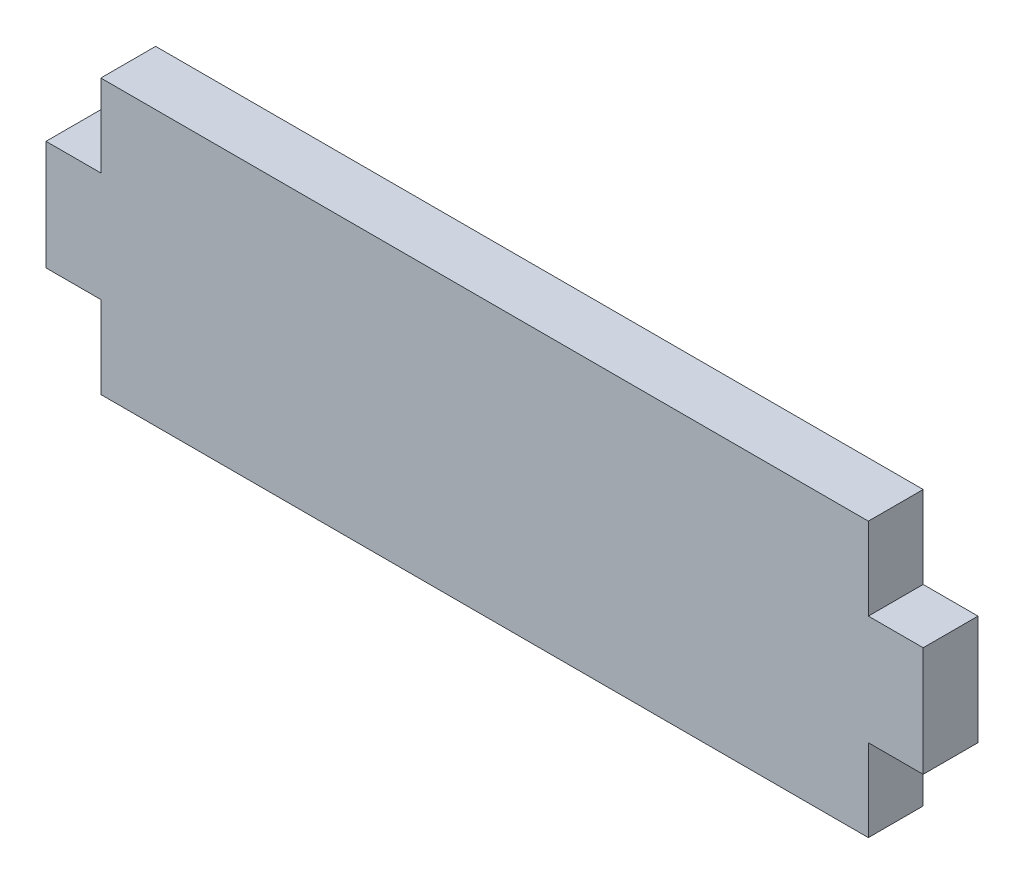
ISO-10303-21;
HEADER;
FILE_DESCRIPTION(('STEP AP214'),'2;1');
FILE_NAME('part.step','',(''),(''),'','','');
FILE_SCHEMA(('AUTOMOTIVE_DESIGN { 1 0 10303 214 1 1 1 1 }'));
ENDSEC;
DATA;
#1=APPLICATION_CONTEXT('core data for automotive mechanical design processes');
#2=APPLICATION_PROTOCOL_DEFINITION('international standard','automotive_design',2000,#1);
#3=PRODUCT_CONTEXT('',#1,'mechanical');
#4=PRODUCT('Part','Part','',(#3));
#5=PRODUCT_RELATED_PRODUCT_CATEGORY('part','',(#4));
#6=PRODUCT_DEFINITION_FORMATION('','',#4);
#7=PRODUCT_DEFINITION_CONTEXT('part definition',#1,'design');
#8=PRODUCT_DEFINITION('design','',#6,#7);
#9=PRODUCT_DEFINITION_SHAPE('','',#8);
#10=(LENGTH_UNIT() NAMED_UNIT(*) SI_UNIT(.MILLI.,.METRE.));
#11=(NAMED_UNIT(*) PLANE_ANGLE_UNIT() SI_UNIT($,.RADIAN.));
#12=(NAMED_UNIT(*) SI_UNIT($,.STERADIAN.) SOLID_ANGLE_UNIT());
#13=UNCERTAINTY_MEASURE_WITH_UNIT(LENGTH_MEASURE(1.E-05),#10,'distance_accuracy_value','');
#14=(GEOMETRIC_REPRESENTATION_CONTEXT(3) GLOBAL_UNCERTAINTY_ASSIGNED_CONTEXT((#13)) GLOBAL_UNIT_ASSIGNED_CONTEXT((#10,
#11,#12)) REPRESENTATION_CONTEXT('',''));
#15=CARTESIAN_POINT('',(0.,0.,0.));
#16=DIRECTION('',(0.,0.,1.));
#17=DIRECTION('',(1.,0.,0.));
#18=AXIS2_PLACEMENT_3D('',#15,#16,#17);
#19=CARTESIAN_POINT('',(35.,-5.,5.));
#20=DIRECTION('',(-1.,0.,0.));
#21=DIRECTION('',(0.,-1.,0.));
#22=AXIS2_PLACEMENT_3D('',#19,#20,#21);
#23=PLANE('',#22);
#24=DIRECTION('',(0.,1.,0.));
#25=VECTOR('',#24,1.);
#26=CARTESIAN_POINT('',(35.,-5.,0.));
#27=LINE('',#26,#25);
#28=CARTESIAN_POINT('',(35.,-12.5,0.));
#29=VERTEX_POINT('',#28);
#30=CARTESIAN_POINT('',(35.,-5.,0.));
#31=VERTEX_POINT('',#30);
#32=EDGE_CURVE('E164',#29,#31,#27,.T.);
#33=ORIENTED_EDGE('',*,*,#32,.T.);
#34=DIRECTION('',(0.,0.,-1.));
#35=VECTOR('',#34,1.);
#36=CARTESIAN_POINT('',(35.,-5.,5.));
#37=LINE('',#36,#35);
#38=CARTESIAN_POINT('',(35.,-5.,5.));
#39=VERTEX_POINT('',#38);
#40=EDGE_CURVE('E11',#39,#31,#37,.T.);
#41=ORIENTED_EDGE('',*,*,#40,.F.);
#42=DIRECTION('',(0.,1.,0.));
#43=VECTOR('',#42,1.);
#44=CARTESIAN_POINT('',(35.,-5.,5.));
#45=LINE('',#44,#43);
#46=CARTESIAN_POINT('',(35.,-12.5,5.));
#47=VERTEX_POINT('',#46);
#48=EDGE_CURVE('E198',#47,#39,#45,.T.);
#49=ORIENTED_EDGE('',*,*,#48,.F.);
#50=DIRECTION('',(0.,0.,-1.));
#51=VECTOR('',#50,1.);
#52=CARTESIAN_POINT('',(35.,-12.5,5.));
#53=LINE('',#52,#51);
#54=EDGE_CURVE('E160',#47,#29,#53,.T.);
#55=ORIENTED_EDGE('',*,*,#54,.T.);
#56=EDGE_LOOP('',(#33,#41,#49,#55));
#57=FACE_BOUND('',#56,.T.);
#58=ADVANCED_FACE('F39',(#57),#23,.F.);
#59=CARTESIAN_POINT('',(40.,-5.,5.));
#60=DIRECTION('',(0.,1.,0.));
#61=DIRECTION('',(0.,0.,1.));
#62=AXIS2_PLACEMENT_3D('',#59,#60,#61);
#63=PLANE('',#62);
#64=DIRECTION('',(1.,0.,0.));
#65=VECTOR('',#64,1.);
#66=CARTESIAN_POINT('',(40.,-5.,0.));
#67=LINE('',#66,#65);
#68=CARTESIAN_POINT('',(40.,-5.,0.));
#69=VERTEX_POINT('',#68);
#70=EDGE_CURVE('E168',#31,#69,#67,.T.);
#71=ORIENTED_EDGE('',*,*,#70,.T.);
#72=DIRECTION('',(0.,0.,-1.));
#73=VECTOR('',#72,1.);
#74=CARTESIAN_POINT('',(40.,-5.,5.));
#75=LINE('',#74,#73);
#76=CARTESIAN_POINT('',(40.,-5.,5.));
#77=VERTEX_POINT('',#76);
#78=EDGE_CURVE('E48',#77,#69,#75,.T.);
#79=ORIENTED_EDGE('',*,*,#78,.F.);
#80=DIRECTION('',(1.,0.,0.));
#81=VECTOR('',#80,1.);
#82=CARTESIAN_POINT('',(40.,-5.,5.));
#83=LINE('',#82,#81);
#84=EDGE_CURVE('E111',#39,#77,#83,.T.);
#85=ORIENTED_EDGE('',*,*,#84,.F.);
#86=ORIENTED_EDGE('',*,*,#40,.T.);
#87=EDGE_LOOP('',(#71,#79,#85,#86));
#88=FACE_BOUND('',#87,.T.);
#89=ADVANCED_FACE('F292',(#88),#63,.F.);
#90=CARTESIAN_POINT('',(40.,5.,5.));
#91=DIRECTION('',(-1.,0.,0.));
#92=DIRECTION('',(0.,0.,1.));
#93=AXIS2_PLACEMENT_3D('',#90,#91,#92);
#94=PLANE('',#93);
#95=DIRECTION('',(0.,1.,0.));
#96=VECTOR('',#95,1.);
#97=CARTESIAN_POINT('',(40.,5.,0.));
#98=LINE('',#97,#96);
#99=CARTESIAN_POINT('',(40.,5.,0.));
#100=VERTEX_POINT('',#99);
#101=EDGE_CURVE('E171',#69,#100,#98,.T.);
#102=ORIENTED_EDGE('',*,*,#101,.T.);
#103=DIRECTION('',(0.,0.,-1.));
#104=VECTOR('',#103,1.);
#105=CARTESIAN_POINT('',(40.,5.,5.));
#106=LINE('',#105,#104);
#107=CARTESIAN_POINT('',(40.,5.,5.));
#108=VERTEX_POINT('',#107);
#109=EDGE_CURVE('E225',#108,#100,#106,.T.);
#110=ORIENTED_EDGE('',*,*,#109,.F.);
#111=DIRECTION('',(0.,1.,0.));
#112=VECTOR('',#111,1.);
#113=CARTESIAN_POINT('',(40.,5.,5.));
#114=LINE('',#113,#112);
#115=EDGE_CURVE('E235',#77,#108,#114,.T.);
#116=ORIENTED_EDGE('',*,*,#115,.F.);
#117=ORIENTED_EDGE('',*,*,#78,.T.);
#118=EDGE_LOOP('',(#102,#110,#116,#117));
#119=FACE_BOUND('',#118,.T.);
#120=ADVANCED_FACE('F233',(#119),#94,.F.);
#121=CARTESIAN_POINT('',(40.,5.,5.));
#122=DIRECTION('',(0.,-1.,0.));
#123=DIRECTION('',(0.,0.,-1.));
#124=AXIS2_PLACEMENT_3D('',#121,#122,#123);
#125=PLANE('',#124);
#126=DIRECTION('',(-1.,0.,0.));
#127=VECTOR('',#126,1.);
#128=CARTESIAN_POINT('',(40.,5.,0.));
#129=LINE('',#128,#127);
#130=CARTESIAN_POINT('',(35.,5.,0.));
#131=VERTEX_POINT('',#130);
#132=EDGE_CURVE('E174',#100,#131,#129,.T.);
#133=ORIENTED_EDGE('',*,*,#132,.T.);
#134=DIRECTION('',(0.,0.,-1.));
#135=VECTOR('',#134,1.);
#136=CARTESIAN_POINT('',(35.,5.,5.));
#137=LINE('',#136,#135);
#138=CARTESIAN_POINT('',(35.,5.,5.));
#139=VERTEX_POINT('',#138);
#140=EDGE_CURVE('E221',#139,#131,#137,.T.);
#141=ORIENTED_EDGE('',*,*,#140,.F.);
#142=DIRECTION('',(-1.,0.,0.));
#143=VECTOR('',#142,1.);
#144=CARTESIAN_POINT('',(40.,5.,5.));
#145=LINE('',#144,#143);
#146=EDGE_CURVE('E254',#108,#139,#145,.T.);
#147=ORIENTED_EDGE('',*,*,#146,.F.);
#148=ORIENTED_EDGE('',*,*,#109,.T.);
#149=EDGE_LOOP('',(#133,#141,#147,#148));
#150=FACE_BOUND('',#149,.T.);
#151=ADVANCED_FACE('F244',(#150),#125,.F.);
#152=CARTESIAN_POINT('',(35.,12.5,5.));
#153=DIRECTION('',(-1.,0.,0.));
#154=DIRECTION('',(0.,-1.,0.));
#155=AXIS2_PLACEMENT_3D('',#152,#153,#154);
#156=PLANE('',#155);
#157=DIRECTION('',(0.,1.,0.));
#158=VECTOR('',#157,1.);
#159=CARTESIAN_POINT('',(35.,12.5,0.));
#160=LINE('',#159,#158);
#161=CARTESIAN_POINT('',(35.,12.5,0.));
#162=VERTEX_POINT('',#161);
#163=EDGE_CURVE('E177',#131,#162,#160,.T.);
#164=ORIENTED_EDGE('',*,*,#163,.T.);
#165=DIRECTION('',(0.,0.,-1.));
#166=VECTOR('',#165,1.);
#167=CARTESIAN_POINT('',(35.,12.5,5.));
#168=LINE('',#167,#166);
#169=CARTESIAN_POINT('',(35.,12.5,5.));
#170=VERTEX_POINT('',#169);
#171=EDGE_CURVE('E217',#170,#162,#168,.T.);
#172=ORIENTED_EDGE('',*,*,#171,.F.);
#173=DIRECTION('',(0.,1.,0.));
#174=VECTOR('',#173,1.);
#175=CARTESIAN_POINT('',(35.,12.5,5.));
#176=LINE('',#175,#174);
#177=EDGE_CURVE('E250',#139,#170,#176,.T.);
#178=ORIENTED_EDGE('',*,*,#177,.F.);
#179=ORIENTED_EDGE('',*,*,#140,.T.);
#180=EDGE_LOOP('',(#164,#172,#178,#179));
#181=FACE_BOUND('',#180,.T.);
#182=ADVANCED_FACE('F248',(#181),#156,.F.);
#183=CARTESIAN_POINT('',(-35.,12.5,5.));
#184=DIRECTION('',(0.,-1.,0.));
#185=DIRECTION('',(0.,0.,-1.));
#186=AXIS2_PLACEMENT_3D('',#183,#184,#185);
#187=PLANE('',#186);
#188=DIRECTION('',(-1.,0.,0.));
#189=VECTOR('',#188,1.);
#190=CARTESIAN_POINT('',(-35.,12.5,0.));
#191=LINE('',#190,#189);
#192=CARTESIAN_POINT('',(-35.,12.5,0.));
#193=VERTEX_POINT('',#192);
#194=EDGE_CURVE('E180',#162,#193,#191,.T.);
#195=ORIENTED_EDGE('',*,*,#194,.T.);
#196=DIRECTION('',(0.,0.,-1.));
#197=VECTOR('',#196,1.);
#198=CARTESIAN_POINT('',(-35.,12.5,5.));
#199=LINE('',#198,#197);
#200=CARTESIAN_POINT('',(-35.,12.5,5.));
#201=VERTEX_POINT('',#200);
#202=EDGE_CURVE('E213',#201,#193,#199,.T.);
#203=ORIENTED_EDGE('',*,*,#202,.F.);
#204=DIRECTION('',(-1.,0.,0.));
#205=VECTOR('',#204,1.);
#206=CARTESIAN_POINT('',(-35.,12.5,5.));
#207=LINE('',#206,#205);
#208=EDGE_CURVE('E253',#170,#201,#207,.T.);
#209=ORIENTED_EDGE('',*,*,#208,.F.);
#210=ORIENTED_EDGE('',*,*,#171,.T.);
#211=EDGE_LOOP('',(#195,#203,#209,#210));
#212=FACE_BOUND('',#211,.T.);
#213=ADVANCED_FACE('F305',(#212),#187,.F.);
#214=CARTESIAN_POINT('',(-35.,12.5,5.));
#215=DIRECTION('',(1.,0.,0.));
#216=DIRECTION('',(0.,0.,-1.));
#217=AXIS2_PLACEMENT_3D('',#214,#215,#216);
#218=PLANE('',#217);
#219=DIRECTION('',(0.,-1.,0.));
#220=VECTOR('',#219,1.);
#221=CARTESIAN_POINT('',(-35.,12.5,0.));
#222=LINE('',#221,#220);
#223=CARTESIAN_POINT('',(-35.,5.,0.));
#224=VERTEX_POINT('',#223);
#225=EDGE_CURVE('E183',#193,#224,#222,.T.);
#226=ORIENTED_EDGE('',*,*,#225,.T.);
#227=DIRECTION('',(0.,0.,-1.));
#228=VECTOR('',#227,1.);
#229=CARTESIAN_POINT('',(-35.,5.,5.));
#230=LINE('',#229,#228);
#231=CARTESIAN_POINT('',(-35.,5.,5.));
#232=VERTEX_POINT('',#231);
#233=EDGE_CURVE('E209',#232,#224,#230,.T.);
#234=ORIENTED_EDGE('',*,*,#233,.F.);
#235=DIRECTION('',(0.,-1.,0.));
#236=VECTOR('',#235,1.);
#237=CARTESIAN_POINT('',(-35.,12.5,5.));
#238=LINE('',#237,#236);
#239=EDGE_CURVE('E258',#201,#232,#238,.T.);
#240=ORIENTED_EDGE('',*,*,#239,.F.);
#241=ORIENTED_EDGE('',*,*,#202,.T.);
#242=EDGE_LOOP('',(#226,#234,#240,#241));
#243=FACE_BOUND('',#242,.T.);
#244=ADVANCED_FACE('F308',(#243),#218,.F.);
#245=CARTESIAN_POINT('',(-40.,5.,5.));
#246=DIRECTION('',(0.,-1.,0.));
#247=DIRECTION('',(0.,0.,-1.));
#248=AXIS2_PLACEMENT_3D('',#245,#246,#247);
#249=PLANE('',#248);
#250=DIRECTION('',(-1.,0.,0.));
#251=VECTOR('',#250,1.);
#252=CARTESIAN_POINT('',(-40.,5.,0.));
#253=LINE('',#252,#251);
#254=CARTESIAN_POINT('',(-40.,5.,0.));
#255=VERTEX_POINT('',#254);
#256=EDGE_CURVE('E186',#224,#255,#253,.T.);
#257=ORIENTED_EDGE('',*,*,#256,.T.);
#258=DIRECTION('',(0.,0.,-1.));
#259=VECTOR('',#258,1.);
#260=CARTESIAN_POINT('',(-40.,5.,5.));
#261=LINE('',#260,#259);
#262=CARTESIAN_POINT('',(-40.,5.,5.));
#263=VERTEX_POINT('',#262);
#264=EDGE_CURVE('E205',#263,#255,#261,.T.);
#265=ORIENTED_EDGE('',*,*,#264,.F.);
#266=DIRECTION('',(-1.,0.,0.));
#267=VECTOR('',#266,1.);
#268=CARTESIAN_POINT('',(-40.,5.,5.));
#269=LINE('',#268,#267);
#270=EDGE_CURVE('E265',#232,#263,#269,.T.);
#271=ORIENTED_EDGE('',*,*,#270,.F.);
#272=ORIENTED_EDGE('',*,*,#233,.T.);
#273=EDGE_LOOP('',(#257,#265,#271,#272));
#274=FACE_BOUND('',#273,.T.);
#275=ADVANCED_FACE('F273',(#274),#249,.F.);
#276=CARTESIAN_POINT('',(-40.,5.,5.));
#277=DIRECTION('',(1.,0.,0.));
#278=DIRECTION('',(0.,0.,-1.));
#279=AXIS2_PLACEMENT_3D('',#276,#277,#278);
#280=PLANE('',#279);
#281=DIRECTION('',(0.,-1.,0.));
#282=VECTOR('',#281,1.);
#283=CARTESIAN_POINT('',(-40.,5.,0.));
#284=LINE('',#283,#282);
#285=CARTESIAN_POINT('',(-40.,-5.,0.));
#286=VERTEX_POINT('',#285);
#287=EDGE_CURVE('E189',#255,#286,#284,.T.);
#288=ORIENTED_EDGE('',*,*,#287,.T.);
#289=DIRECTION('',(0.,0.,-1.));
#290=VECTOR('',#289,1.);
#291=CARTESIAN_POINT('',(-40.,-5.,5.));
#292=LINE('',#291,#290);
#293=CARTESIAN_POINT('',(-40.,-5.,5.));
#294=VERTEX_POINT('',#293);
#295=EDGE_CURVE('E153',#294,#286,#292,.T.);
#296=ORIENTED_EDGE('',*,*,#295,.F.);
#297=DIRECTION('',(0.,-1.,0.));
#298=VECTOR('',#297,1.);
#299=CARTESIAN_POINT('',(-40.,5.,5.));
#300=LINE('',#299,#298);
#301=EDGE_CURVE('E142',#263,#294,#300,.T.);
#302=ORIENTED_EDGE('',*,*,#301,.F.);
#303=ORIENTED_EDGE('',*,*,#264,.T.);
#304=EDGE_LOOP('',(#288,#296,#302,#303));
#305=FACE_BOUND('',#304,.T.);
#306=ADVANCED_FACE('F277',(#305),#280,.F.);
#307=CARTESIAN_POINT('',(-40.,-5.,5.));
#308=DIRECTION('',(0.,1.,0.));
#309=DIRECTION('',(0.,0.,1.));
#310=AXIS2_PLACEMENT_3D('',#307,#308,#309);
#311=PLANE('',#310);
#312=DIRECTION('',(1.,0.,0.));
#313=VECTOR('',#312,1.);
#314=CARTESIAN_POINT('',(-40.,-5.,0.));
#315=LINE('',#314,#313);
#316=CARTESIAN_POINT('',(-35.,-5.,0.));
#317=VERTEX_POINT('',#316);
#318=EDGE_CURVE('E151',#286,#317,#315,.T.);
#319=ORIENTED_EDGE('',*,*,#318,.T.);
#320=DIRECTION('',(0.,0.,-1.));
#321=VECTOR('',#320,1.);
#322=CARTESIAN_POINT('',(-35.,-5.,5.));
#323=LINE('',#322,#321);
#324=CARTESIAN_POINT('',(-35.,-5.,5.));
#325=VERTEX_POINT('',#324);
#326=EDGE_CURVE('E148',#325,#317,#323,.T.);
#327=ORIENTED_EDGE('',*,*,#326,.F.);
#328=DIRECTION('',(1.,0.,0.));
#329=VECTOR('',#328,1.);
#330=CARTESIAN_POINT('',(-40.,-5.,5.));
#331=LINE('',#330,#329);
#332=EDGE_CURVE('E136',#294,#325,#331,.T.);
#333=ORIENTED_EDGE('',*,*,#332,.F.);
#334=ORIENTED_EDGE('',*,*,#295,.T.);
#335=EDGE_LOOP('',(#319,#327,#333,#334));
#336=FACE_BOUND('',#335,.T.);
#337=ADVANCED_FACE('F149',(#336),#311,.F.);
#338=CARTESIAN_POINT('',(-35.,-5.,5.));
#339=DIRECTION('',(1.,0.,0.));
#340=DIRECTION('',(0.,0.,-1.));
#341=AXIS2_PLACEMENT_3D('',#338,#339,#340);
#342=PLANE('',#341);
#343=DIRECTION('',(0.,-1.,0.));
#344=VECTOR('',#343,1.);
#345=CARTESIAN_POINT('',(-35.,-5.,0.));
#346=LINE('',#345,#344);
#347=CARTESIAN_POINT('',(-35.,-12.5,0.));
#348=VERTEX_POINT('',#347);
#349=EDGE_CURVE('E97',#317,#348,#346,.T.);
#350=ORIENTED_EDGE('',*,*,#349,.T.);
#351=DIRECTION('',(0.,0.,-1.));
#352=VECTOR('',#351,1.);
#353=CARTESIAN_POINT('',(-35.,-12.5,5.));
#354=LINE('',#353,#352);
#355=CARTESIAN_POINT('',(-35.,-12.5,5.));
#356=VERTEX_POINT('',#355);
#357=EDGE_CURVE('E154',#356,#348,#354,.T.);
#358=ORIENTED_EDGE('',*,*,#357,.F.);
#359=DIRECTION('',(0.,-1.,0.));
#360=VECTOR('',#359,1.);
#361=CARTESIAN_POINT('',(-35.,-5.,5.));
#362=LINE('',#361,#360);
#363=EDGE_CURVE('E140',#325,#356,#362,.T.);
#364=ORIENTED_EDGE('',*,*,#363,.F.);
#365=ORIENTED_EDGE('',*,*,#326,.T.);
#366=EDGE_LOOP('',(#350,#358,#364,#365));
#367=FACE_BOUND('',#366,.T.);
#368=ADVANCED_FACE('F156',(#367),#342,.F.);
#369=CARTESIAN_POINT('',(-35.,-12.5,5.));
#370=DIRECTION('',(0.,1.,0.));
#371=DIRECTION('',(0.,0.,1.));
#372=AXIS2_PLACEMENT_3D('',#369,#370,#371);
#373=PLANE('',#372);
#374=DIRECTION('',(1.,0.,0.));
#375=VECTOR('',#374,1.);
#376=CARTESIAN_POINT('',(-35.,-12.5,0.));
#377=LINE('',#376,#375);
#378=EDGE_CURVE('E103',#348,#29,#377,.T.);
#379=ORIENTED_EDGE('',*,*,#378,.T.);
#380=ORIENTED_EDGE('',*,*,#54,.F.);
#381=DIRECTION('',(1.,0.,0.));
#382=VECTOR('',#381,1.);
#383=CARTESIAN_POINT('',(-35.,-12.5,5.));
#384=LINE('',#383,#382);
#385=EDGE_CURVE('E56',#356,#47,#384,.T.);
#386=ORIENTED_EDGE('',*,*,#385,.F.);
#387=ORIENTED_EDGE('',*,*,#357,.T.);
#388=EDGE_LOOP('',(#379,#380,#386,#387));
#389=FACE_BOUND('',#388,.T.);
#390=ADVANCED_FACE('F281',(#389),#373,.F.);
#391=CARTESIAN_POINT('',(0.,0.,5.));
#392=DIRECTION('',(0.,0.,1.));
#393=DIRECTION('',(1.,0.,0.));
#394=AXIS2_PLACEMENT_3D('',#391,#392,#393);
#395=PLANE('',#394);
#396=ORIENTED_EDGE('',*,*,#48,.T.);
#397=ORIENTED_EDGE('',*,*,#84,.T.);
#398=ORIENTED_EDGE('',*,*,#115,.T.);
#399=ORIENTED_EDGE('',*,*,#146,.T.);
#400=ORIENTED_EDGE('',*,*,#177,.T.);
#401=ORIENTED_EDGE('',*,*,#208,.T.);
#402=ORIENTED_EDGE('',*,*,#239,.T.);
#403=ORIENTED_EDGE('',*,*,#270,.T.);
#404=ORIENTED_EDGE('',*,*,#301,.T.);
#405=ORIENTED_EDGE('',*,*,#332,.T.);
#406=ORIENTED_EDGE('',*,*,#363,.T.);
#407=ORIENTED_EDGE('',*,*,#385,.T.);
#408=EDGE_LOOP('',(#396,#397,#398,#399,#400,#401,#402,#403,#404,#405,#406,#407));
#409=FACE_BOUND('',#408,.T.);
#410=ADVANCED_FACE('F138',(#409),#395,.T.);
#411=CARTESIAN_POINT('',(0.,0.,0.));
#412=DIRECTION('',(0.,0.,1.));
#413=DIRECTION('',(1.,0.,0.));
#414=AXIS2_PLACEMENT_3D('',#411,#412,#413);
#415=PLANE('',#414);
#416=ORIENTED_EDGE('',*,*,#32,.F.);
#417=ORIENTED_EDGE('',*,*,#378,.F.);
#418=ORIENTED_EDGE('',*,*,#349,.F.);
#419=ORIENTED_EDGE('',*,*,#318,.F.);
#420=ORIENTED_EDGE('',*,*,#287,.F.);
#421=ORIENTED_EDGE('',*,*,#256,.F.);
#422=ORIENTED_EDGE('',*,*,#225,.F.);
#423=ORIENTED_EDGE('',*,*,#194,.F.);
#424=ORIENTED_EDGE('',*,*,#163,.F.);
#425=ORIENTED_EDGE('',*,*,#132,.F.);
#426=ORIENTED_EDGE('',*,*,#101,.F.);
#427=ORIENTED_EDGE('',*,*,#70,.F.);
#428=EDGE_LOOP('',(#416,#417,#418,#419,#420,#421,#422,#423,#424,#425,#426,#427));
#429=FACE_BOUND('',#428,.T.);
#430=ADVANCED_FACE('F239',(#429),#415,.F.);
#431=CLOSED_SHELL('',(#58,#89,#120,#151,#182,#213,#244,#275,#306,#337,#368,#390,#410,#430));
#432=MANIFOLD_SOLID_BREP('B2',#431);
#433=ADVANCED_BREP_SHAPE_REPRESENTATION('',(#18,#432),#14);
#434=SHAPE_DEFINITION_REPRESENTATION(#9,#433);
ENDSEC;
END-ISO-10303-21;
